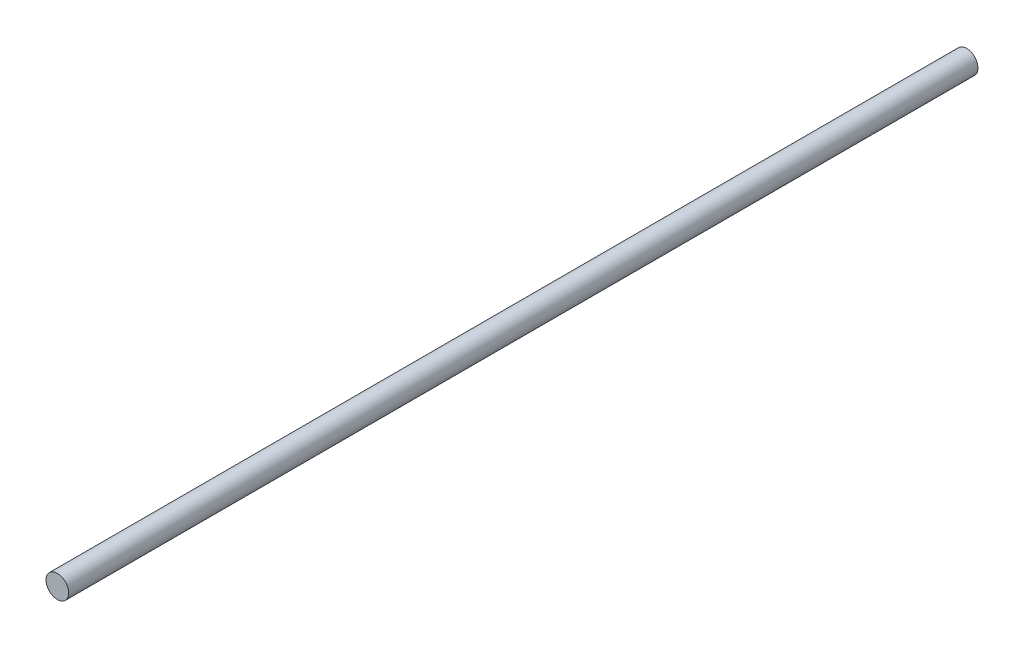
ISO-10303-21;
HEADER;
FILE_DESCRIPTION(('STEP AP214'),'2;1');
FILE_NAME('part.step','',(''),(''),'','','');
FILE_SCHEMA(('AUTOMOTIVE_DESIGN { 1 0 10303 214 1 1 1 1 }'));
ENDSEC;
DATA;
#1=APPLICATION_CONTEXT('core data for automotive mechanical design processes');
#2=APPLICATION_PROTOCOL_DEFINITION('international standard','automotive_design',2000,#1);
#3=PRODUCT_CONTEXT('',#1,'mechanical');
#4=PRODUCT('Part','Part','',(#3));
#5=PRODUCT_RELATED_PRODUCT_CATEGORY('part','',(#4));
#6=PRODUCT_DEFINITION_FORMATION('','',#4);
#7=PRODUCT_DEFINITION_CONTEXT('part definition',#1,'design');
#8=PRODUCT_DEFINITION('design','',#6,#7);
#9=PRODUCT_DEFINITION_SHAPE('','',#8);
#10=(LENGTH_UNIT() NAMED_UNIT(*) SI_UNIT(.MILLI.,.METRE.));
#11=(NAMED_UNIT(*) PLANE_ANGLE_UNIT() SI_UNIT($,.RADIAN.));
#12=(NAMED_UNIT(*) SI_UNIT($,.STERADIAN.) SOLID_ANGLE_UNIT());
#13=UNCERTAINTY_MEASURE_WITH_UNIT(LENGTH_MEASURE(1.E-05),#10,'distance_accuracy_value','');
#14=(GEOMETRIC_REPRESENTATION_CONTEXT(3) GLOBAL_UNCERTAINTY_ASSIGNED_CONTEXT((#13)) GLOBAL_UNIT_ASSIGNED_CONTEXT((#10,
#11,#12)) REPRESENTATION_CONTEXT('',''));
#15=CARTESIAN_POINT('',(0.,0.,0.));
#16=DIRECTION('',(0.,0.,1.));
#17=DIRECTION('',(1.,0.,0.));
#18=AXIS2_PLACEMENT_3D('',#15,#16,#17);
#19=CARTESIAN_POINT('',(0.,0.,400.));
#20=DIRECTION('',(0.,0.,-1.));
#21=DIRECTION('',(-1.,0.,0.));
#22=AXIS2_PLACEMENT_3D('',#19,#20,#21);
#23=CYLINDRICAL_SURFACE('',#22,5.);
#24=CARTESIAN_POINT('',(0.,0.,400.));
#25=DIRECTION('',(0.,0.,1.));
#26=DIRECTION('',(1.,0.,0.));
#27=AXIS2_PLACEMENT_3D('',#24,#25,#26);
#28=CIRCLE('',#27,5.);
#29=CARTESIAN_POINT('',(5.,0.,400.));
#30=VERTEX_POINT('',#29);
#31=EDGE_CURVE('E10',#30,#30,#28,.T.);
#32=ORIENTED_EDGE('',*,*,#31,.F.);
#33=EDGE_LOOP('',(#32));
#34=FACE_BOUND('',#33,.T.);
#35=CARTESIAN_POINT('',(0.,0.,0.));
#36=DIRECTION('',(0.,0.,1.));
#37=DIRECTION('',(1.,0.,0.));
#38=AXIS2_PLACEMENT_3D('',#35,#36,#37);
#39=CIRCLE('',#38,5.);
#40=CARTESIAN_POINT('',(5.,0.,0.));
#41=VERTEX_POINT('',#40);
#42=EDGE_CURVE('E37',#41,#41,#39,.T.);
#43=ORIENTED_EDGE('',*,*,#42,.T.);
#44=EDGE_LOOP('',(#43));
#45=FACE_BOUND('',#44,.T.);
#46=ADVANCED_FACE('F34',(#34,#45),#23,.T.);
#47=CARTESIAN_POINT('',(0.,0.,400.));
#48=DIRECTION('',(0.,0.,1.));
#49=DIRECTION('',(1.,0.,0.));
#50=AXIS2_PLACEMENT_3D('',#47,#48,#49);
#51=PLANE('',#50);
#52=ORIENTED_EDGE('',*,*,#31,.T.);
#53=EDGE_LOOP('',(#52));
#54=FACE_BOUND('',#53,.T.);
#55=ADVANCED_FACE('F49',(#54),#51,.T.);
#56=CARTESIAN_POINT('',(0.,0.,0.));
#57=DIRECTION('',(0.,0.,1.));
#58=DIRECTION('',(1.,0.,0.));
#59=AXIS2_PLACEMENT_3D('',#56,#57,#58);
#60=PLANE('',#59);
#61=ORIENTED_EDGE('',*,*,#42,.F.);
#62=EDGE_LOOP('',(#61));
#63=FACE_BOUND('',#62,.T.);
#64=ADVANCED_FACE('F47',(#63),#60,.F.);
#65=CLOSED_SHELL('',(#46,#55,#64));
#66=MANIFOLD_SOLID_BREP('B2',#65);
#67=ADVANCED_BREP_SHAPE_REPRESENTATION('',(#18,#66),#14);
#68=SHAPE_DEFINITION_REPRESENTATION(#9,#67);
ENDSEC;
END-ISO-10303-21;
